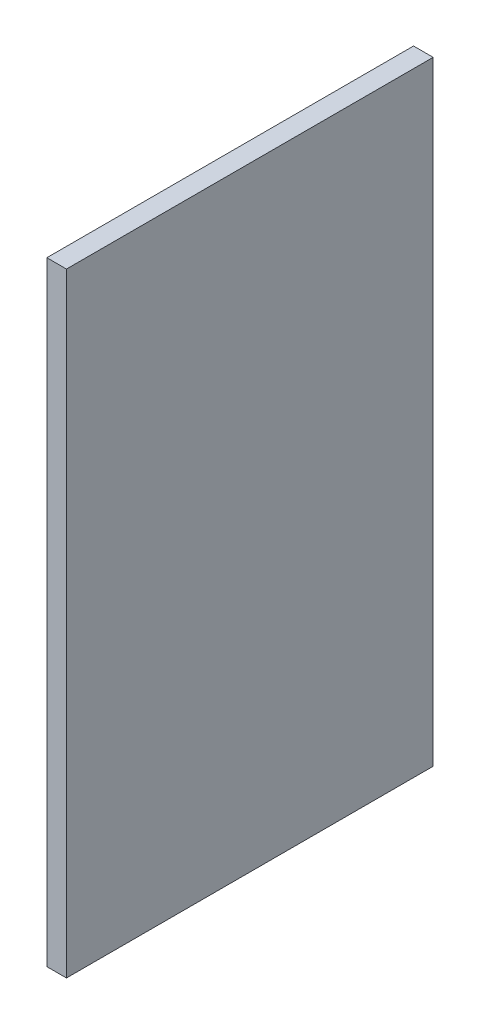
ISO-10303-21;
HEADER;
FILE_DESCRIPTION(('STEP AP214'),'2;1');
FILE_NAME('part.step','',(''),(''),'','','');
FILE_SCHEMA(('AUTOMOTIVE_DESIGN { 1 0 10303 214 1 1 1 1 }'));
ENDSEC;
DATA;
#1=APPLICATION_CONTEXT('core data for automotive mechanical design processes');
#2=APPLICATION_PROTOCOL_DEFINITION('international standard','automotive_design',2000,#1);
#3=PRODUCT_CONTEXT('',#1,'mechanical');
#4=PRODUCT('Part','Part','',(#3));
#5=PRODUCT_RELATED_PRODUCT_CATEGORY('part','',(#4));
#6=PRODUCT_DEFINITION_FORMATION('','',#4);
#7=PRODUCT_DEFINITION_CONTEXT('part definition',#1,'design');
#8=PRODUCT_DEFINITION('design','',#6,#7);
#9=PRODUCT_DEFINITION_SHAPE('','',#8);
#10=(LENGTH_UNIT() NAMED_UNIT(*) SI_UNIT(.MILLI.,.METRE.));
#11=(NAMED_UNIT(*) PLANE_ANGLE_UNIT() SI_UNIT($,.RADIAN.));
#12=(NAMED_UNIT(*) SI_UNIT($,.STERADIAN.) SOLID_ANGLE_UNIT());
#13=UNCERTAINTY_MEASURE_WITH_UNIT(LENGTH_MEASURE(1.E-05),#10,'distance_accuracy_value','');
#14=(GEOMETRIC_REPRESENTATION_CONTEXT(3) GLOBAL_UNCERTAINTY_ASSIGNED_CONTEXT((#13)) GLOBAL_UNIT_ASSIGNED_CONTEXT((#10,
#11,#12)) REPRESENTATION_CONTEXT('',''));
#15=CARTESIAN_POINT('',(0.,0.,0.));
#16=DIRECTION('',(0.,0.,1.));
#17=DIRECTION('',(1.,0.,0.));
#18=AXIS2_PLACEMENT_3D('',#15,#16,#17);
#19=CARTESIAN_POINT('',(18.25625,0.,0.));
#20=DIRECTION('',(0.,0.,1.));
#21=DIRECTION('',(0.,-1.,0.));
#22=AXIS2_PLACEMENT_3D('',#19,#20,#21);
#23=PLANE('',#22);
#24=DIRECTION('',(0.,1.,0.));
#25=VECTOR('',#24,1.);
#26=CARTESIAN_POINT('',(0.,0.,0.));
#27=LINE('',#26,#25);
#28=CARTESIAN_POINT('',(0.,0.,0.));
#29=VERTEX_POINT('',#28);
#30=CARTESIAN_POINT('',(0.,571.5,0.));
#31=VERTEX_POINT('',#30);
#32=EDGE_CURVE('E96',#29,#31,#27,.T.);
#33=ORIENTED_EDGE('',*,*,#32,.T.);
#34=DIRECTION('',(-1.,0.,0.));
#35=VECTOR('',#34,1.);
#36=CARTESIAN_POINT('',(18.25625,571.5,0.));
#37=LINE('',#36,#35);
#38=CARTESIAN_POINT('',(18.25625,571.5,0.));
#39=VERTEX_POINT('',#38);
#40=EDGE_CURVE('E11',#39,#31,#37,.T.);
#41=ORIENTED_EDGE('',*,*,#40,.F.);
#42=DIRECTION('',(0.,1.,0.));
#43=VECTOR('',#42,1.);
#44=CARTESIAN_POINT('',(18.25625,0.,0.));
#45=LINE('',#44,#43);
#46=CARTESIAN_POINT('',(18.25625,0.,0.));
#47=VERTEX_POINT('',#46);
#48=EDGE_CURVE('E84',#47,#39,#45,.T.);
#49=ORIENTED_EDGE('',*,*,#48,.F.);
#50=DIRECTION('',(-1.,0.,0.));
#51=VECTOR('',#50,1.);
#52=CARTESIAN_POINT('',(18.25625,0.,0.));
#53=LINE('',#52,#51);
#54=EDGE_CURVE('E92',#47,#29,#53,.T.);
#55=ORIENTED_EDGE('',*,*,#54,.T.);
#56=EDGE_LOOP('',(#33,#41,#49,#55));
#57=FACE_BOUND('',#56,.T.);
#58=ADVANCED_FACE('F33',(#57),#23,.F.);
#59=CARTESIAN_POINT('',(18.25625,571.5,0.));
#60=DIRECTION('',(0.,-1.,0.));
#61=DIRECTION('',(0.,0.,-1.));
#62=AXIS2_PLACEMENT_3D('',#59,#60,#61);
#63=PLANE('',#62);
#64=DIRECTION('',(0.,0.,1.));
#65=VECTOR('',#64,1.);
#66=CARTESIAN_POINT('',(0.,571.5,0.));
#67=LINE('',#66,#65);
#68=CARTESIAN_POINT('',(0.,571.5,341.3125));
#69=VERTEX_POINT('',#68);
#70=EDGE_CURVE('E88',#31,#69,#67,.T.);
#71=ORIENTED_EDGE('',*,*,#70,.T.);
#72=DIRECTION('',(-1.,0.,0.));
#73=VECTOR('',#72,1.);
#74=CARTESIAN_POINT('',(18.25625,571.5,341.3125));
#75=LINE('',#74,#73);
#76=CARTESIAN_POINT('',(18.25625,571.5,341.3125));
#77=VERTEX_POINT('',#76);
#78=EDGE_CURVE('E41',#77,#69,#75,.T.);
#79=ORIENTED_EDGE('',*,*,#78,.F.);
#80=DIRECTION('',(0.,0.,1.));
#81=VECTOR('',#80,1.);
#82=CARTESIAN_POINT('',(18.25625,571.5,0.));
#83=LINE('',#82,#81);
#84=EDGE_CURVE('E79',#39,#77,#83,.T.);
#85=ORIENTED_EDGE('',*,*,#84,.F.);
#86=ORIENTED_EDGE('',*,*,#40,.T.);
#87=EDGE_LOOP('',(#71,#79,#85,#86));
#88=FACE_BOUND('',#87,.T.);
#89=ADVANCED_FACE('F87',(#88),#63,.F.);
#90=CARTESIAN_POINT('',(18.25625,0.,341.3125));
#91=DIRECTION('',(0.,0.,-1.));
#92=DIRECTION('',(-1.,0.,0.));
#93=AXIS2_PLACEMENT_3D('',#90,#91,#92);
#94=PLANE('',#93);
#95=DIRECTION('',(0.,-1.,0.));
#96=VECTOR('',#95,1.);
#97=CARTESIAN_POINT('',(0.,0.,341.3125));
#98=LINE('',#97,#96);
#99=CARTESIAN_POINT('',(0.,0.,341.3125));
#100=VERTEX_POINT('',#99);
#101=EDGE_CURVE('E66',#69,#100,#98,.T.);
#102=ORIENTED_EDGE('',*,*,#101,.T.);
#103=DIRECTION('',(-1.,0.,0.));
#104=VECTOR('',#103,1.);
#105=CARTESIAN_POINT('',(18.25625,0.,341.3125));
#106=LINE('',#105,#104);
#107=CARTESIAN_POINT('',(18.25625,0.,341.3125));
#108=VERTEX_POINT('',#107);
#109=EDGE_CURVE('E89',#108,#100,#106,.T.);
#110=ORIENTED_EDGE('',*,*,#109,.F.);
#111=DIRECTION('',(0.,-1.,0.));
#112=VECTOR('',#111,1.);
#113=CARTESIAN_POINT('',(18.25625,0.,341.3125));
#114=LINE('',#113,#112);
#115=EDGE_CURVE('E82',#77,#108,#114,.T.);
#116=ORIENTED_EDGE('',*,*,#115,.F.);
#117=ORIENTED_EDGE('',*,*,#78,.T.);
#118=EDGE_LOOP('',(#102,#110,#116,#117));
#119=FACE_BOUND('',#118,.T.);
#120=ADVANCED_FACE('F90',(#119),#94,.F.);
#121=CARTESIAN_POINT('',(18.25625,0.,0.));
#122=DIRECTION('',(0.,1.,0.));
#123=DIRECTION('',(0.,0.,1.));
#124=AXIS2_PLACEMENT_3D('',#121,#122,#123);
#125=PLANE('',#124);
#126=DIRECTION('',(0.,0.,-1.));
#127=VECTOR('',#126,1.);
#128=CARTESIAN_POINT('',(0.,0.,0.));
#129=LINE('',#128,#127);
#130=EDGE_CURVE('E72',#100,#29,#129,.T.);
#131=ORIENTED_EDGE('',*,*,#130,.T.);
#132=ORIENTED_EDGE('',*,*,#54,.F.);
#133=DIRECTION('',(0.,0.,-1.));
#134=VECTOR('',#133,1.);
#135=CARTESIAN_POINT('',(18.25625,0.,0.));
#136=LINE('',#135,#134);
#137=EDGE_CURVE('E49',#108,#47,#136,.T.);
#138=ORIENTED_EDGE('',*,*,#137,.F.);
#139=ORIENTED_EDGE('',*,*,#109,.T.);
#140=EDGE_LOOP('',(#131,#132,#138,#139));
#141=FACE_BOUND('',#140,.T.);
#142=ADVANCED_FACE('F103',(#141),#125,.F.);
#143=CARTESIAN_POINT('',(18.25625,0.,0.));
#144=DIRECTION('',(1.,0.,0.));
#145=DIRECTION('',(0.,0.,-1.));
#146=AXIS2_PLACEMENT_3D('',#143,#144,#145);
#147=PLANE('',#146);
#148=ORIENTED_EDGE('',*,*,#48,.T.);
#149=ORIENTED_EDGE('',*,*,#84,.T.);
#150=ORIENTED_EDGE('',*,*,#115,.T.);
#151=ORIENTED_EDGE('',*,*,#137,.T.);
#152=EDGE_LOOP('',(#148,#149,#150,#151));
#153=FACE_BOUND('',#152,.T.);
#154=ADVANCED_FACE('F80',(#153),#147,.T.);
#155=CARTESIAN_POINT('',(0.,0.,0.));
#156=DIRECTION('',(1.,0.,0.));
#157=DIRECTION('',(0.,0.,-1.));
#158=AXIS2_PLACEMENT_3D('',#155,#156,#157);
#159=PLANE('',#158);
#160=ORIENTED_EDGE('',*,*,#32,.F.);
#161=ORIENTED_EDGE('',*,*,#130,.F.);
#162=ORIENTED_EDGE('',*,*,#101,.F.);
#163=ORIENTED_EDGE('',*,*,#70,.F.);
#164=EDGE_LOOP('',(#160,#161,#162,#163));
#165=FACE_BOUND('',#164,.T.);
#166=ADVANCED_FACE('F106',(#165),#159,.F.);
#167=CLOSED_SHELL('',(#58,#89,#120,#142,#154,#166));
#168=MANIFOLD_SOLID_BREP('B2',#167);
#169=ADVANCED_BREP_SHAPE_REPRESENTATION('',(#18,#168),#14);
#170=SHAPE_DEFINITION_REPRESENTATION(#9,#169);
ENDSEC;
END-ISO-10303-21;
